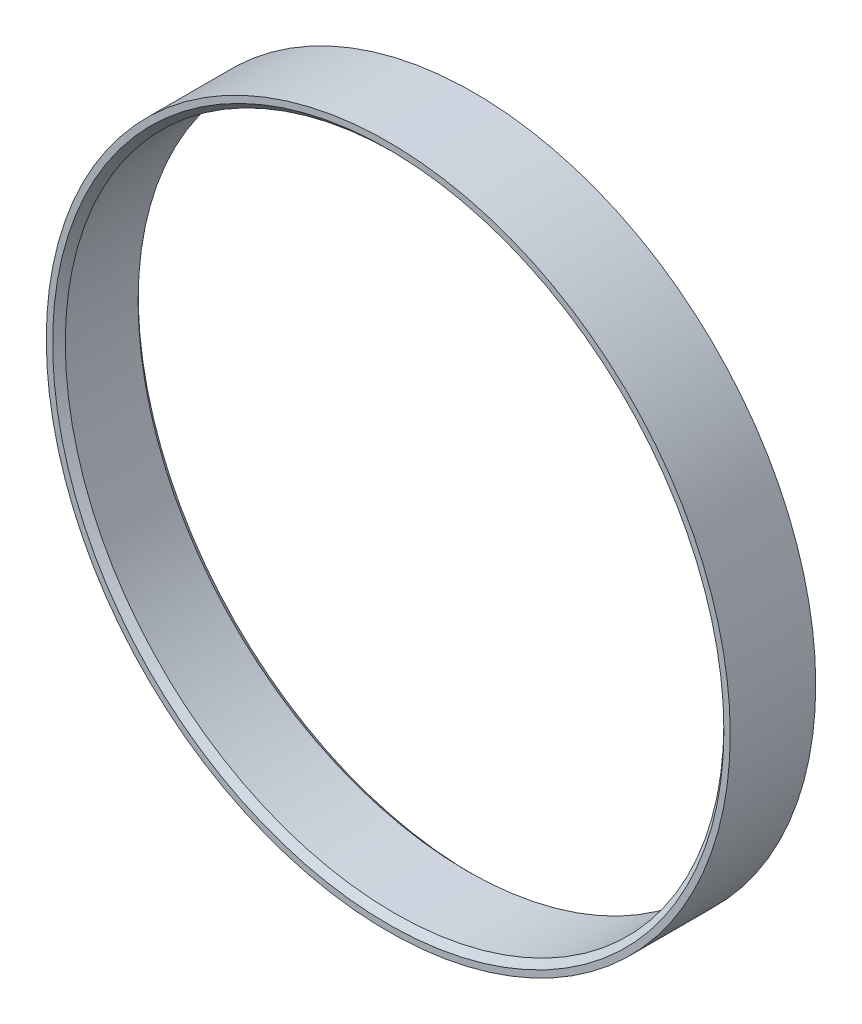
ISO-10303-21;
HEADER;
FILE_DESCRIPTION(('STEP AP214'),'2;1');
FILE_NAME('part.step','',(''),(''),'','','');
FILE_SCHEMA(('AUTOMOTIVE_DESIGN { 1 0 10303 214 1 1 1 1 }'));
ENDSEC;
DATA;
#1=APPLICATION_CONTEXT('core data for automotive mechanical design processes');
#2=APPLICATION_PROTOCOL_DEFINITION('international standard','automotive_design',2000,#1);
#3=PRODUCT_CONTEXT('',#1,'mechanical');
#4=PRODUCT('Part','Part','',(#3));
#5=PRODUCT_RELATED_PRODUCT_CATEGORY('part','',(#4));
#6=PRODUCT_DEFINITION_FORMATION('','',#4);
#7=PRODUCT_DEFINITION_CONTEXT('part definition',#1,'design');
#8=PRODUCT_DEFINITION('design','',#6,#7);
#9=PRODUCT_DEFINITION_SHAPE('','',#8);
#10=(LENGTH_UNIT() NAMED_UNIT(*) SI_UNIT(.MILLI.,.METRE.));
#11=(NAMED_UNIT(*) PLANE_ANGLE_UNIT() SI_UNIT($,.RADIAN.));
#12=(NAMED_UNIT(*) SI_UNIT($,.STERADIAN.) SOLID_ANGLE_UNIT());
#13=UNCERTAINTY_MEASURE_WITH_UNIT(LENGTH_MEASURE(1.E-05),#10,'distance_accuracy_value','');
#14=(GEOMETRIC_REPRESENTATION_CONTEXT(3) GLOBAL_UNCERTAINTY_ASSIGNED_CONTEXT((#13)) GLOBAL_UNIT_ASSIGNED_CONTEXT((#10,
#11,#12)) REPRESENTATION_CONTEXT('',''));
#15=CARTESIAN_POINT('',(0.,0.,0.));
#16=DIRECTION('',(0.,0.,1.));
#17=DIRECTION('',(1.,0.,0.));
#18=AXIS2_PLACEMENT_3D('',#15,#16,#17);
#19=CARTESIAN_POINT('',(0.,0.,13.5));
#20=DIRECTION('',(0.,0.,1.));
#21=DIRECTION('',(1.,0.,0.));
#22=AXIS2_PLACEMENT_3D('',#19,#20,#21);
#23=PLANE('',#22);
#24=CARTESIAN_POINT('',(0.,0.,13.5));
#25=DIRECTION('',(0.,0.,1.));
#26=DIRECTION('',(1.,0.,0.));
#27=AXIS2_PLACEMENT_3D('',#24,#25,#26);
#28=CIRCLE('',#27,53.);
#29=CARTESIAN_POINT('',(53.,0.,13.5));
#30=VERTEX_POINT('',#29);
#31=EDGE_CURVE('E10',#30,#30,#28,.F.);
#32=ORIENTED_EDGE('',*,*,#31,.T.);
#33=EDGE_LOOP('',(#32));
#34=FACE_BOUND('',#33,.T.);
#35=CARTESIAN_POINT('',(0.,0.,13.5));
#36=DIRECTION('',(0.,0.,1.));
#37=DIRECTION('',(1.,0.,0.));
#38=AXIS2_PLACEMENT_3D('',#35,#36,#37);
#39=CIRCLE('',#38,54.);
#40=CARTESIAN_POINT('',(54.,0.,13.5));
#41=VERTEX_POINT('',#40);
#42=EDGE_CURVE('E64',#41,#41,#39,.T.);
#43=ORIENTED_EDGE('',*,*,#42,.T.);
#44=EDGE_LOOP('',(#43));
#45=FACE_BOUND('',#44,.T.);
#46=ADVANCED_FACE('F39',(#34,#45),#23,.T.);
#47=CARTESIAN_POINT('',(0.,0.,0.));
#48=DIRECTION('',(0.,0.,1.));
#49=DIRECTION('',(1.,0.,0.));
#50=AXIS2_PLACEMENT_3D('',#47,#48,#49);
#51=PLANE('',#50);
#52=CARTESIAN_POINT('',(0.,0.,0.));
#53=DIRECTION('',(0.,0.,1.));
#54=DIRECTION('',(1.,0.,0.));
#55=AXIS2_PLACEMENT_3D('',#52,#53,#54);
#56=CIRCLE('',#55,53.);
#57=CARTESIAN_POINT('',(53.,0.,0.));
#58=VERTEX_POINT('',#57);
#59=EDGE_CURVE('E58',#58,#58,#56,.T.);
#60=ORIENTED_EDGE('',*,*,#59,.T.);
#61=EDGE_LOOP('',(#60));
#62=FACE_BOUND('',#61,.T.);
#63=CARTESIAN_POINT('',(0.,0.,0.));
#64=DIRECTION('',(0.,0.,1.));
#65=DIRECTION('',(1.,0.,0.));
#66=AXIS2_PLACEMENT_3D('',#63,#64,#65);
#67=CIRCLE('',#66,54.);
#68=CARTESIAN_POINT('',(54.,0.,0.));
#69=VERTEX_POINT('',#68);
#70=EDGE_CURVE('E65',#69,#69,#67,.T.);
#71=ORIENTED_EDGE('',*,*,#70,.F.);
#72=EDGE_LOOP('',(#71));
#73=FACE_BOUND('',#72,.T.);
#74=ADVANCED_FACE('F78',(#62,#73),#51,.F.);
#75=CARTESIAN_POINT('',(0.,0.,13.5));
#76=DIRECTION('',(0.,0.,-1.));
#77=DIRECTION('',(-1.,0.,0.));
#78=AXIS2_PLACEMENT_3D('',#75,#76,#77);
#79=CYLINDRICAL_SURFACE('',#78,54.);
#80=ORIENTED_EDGE('',*,*,#42,.F.);
#81=EDGE_LOOP('',(#80));
#82=FACE_BOUND('',#81,.T.);
#83=ORIENTED_EDGE('',*,*,#70,.T.);
#84=EDGE_LOOP('',(#83));
#85=FACE_BOUND('',#84,.T.);
#86=ADVANCED_FACE('F74',(#82,#85),#79,.T.);
#87=CARTESIAN_POINT('',(0.,0.,13.5));
#88=DIRECTION('',(0.,0.,-1.));
#89=DIRECTION('',(-1.,0.,0.));
#90=AXIS2_PLACEMENT_3D('',#87,#88,#89);
#91=CYLINDRICAL_SURFACE('',#90,52.);
#92=CARTESIAN_POINT('',(0.,0.,1.00000000000001));
#93=DIRECTION('',(0.,0.,1.));
#94=DIRECTION('',(1.,0.,0.));
#95=AXIS2_PLACEMENT_3D('',#92,#93,#94);
#96=CIRCLE('',#95,52.);
#97=CARTESIAN_POINT('',(52.,0.,1.00000000000001));
#98=VERTEX_POINT('',#97);
#99=EDGE_CURVE('E48',#98,#98,#96,.F.);
#100=ORIENTED_EDGE('',*,*,#99,.T.);
#101=EDGE_LOOP('',(#100));
#102=FACE_BOUND('',#101,.T.);
#103=CARTESIAN_POINT('',(0.,0.,12.5));
#104=DIRECTION('',(0.,0.,1.));
#105=DIRECTION('',(1.,0.,0.));
#106=AXIS2_PLACEMENT_3D('',#103,#104,#105);
#107=CIRCLE('',#106,52.);
#108=CARTESIAN_POINT('',(52.,0.,12.5));
#109=VERTEX_POINT('',#108);
#110=EDGE_CURVE('E53',#109,#109,#107,.T.);
#111=ORIENTED_EDGE('',*,*,#110,.T.);
#112=EDGE_LOOP('',(#111));
#113=FACE_BOUND('',#112,.T.);
#114=ADVANCED_FACE('F77',(#102,#113),#91,.F.);
#115=CARTESIAN_POINT('',(0.,0.,0.));
#116=DIRECTION('',(0.,0.,-1.));
#117=DIRECTION('',(-1.,0.,0.));
#118=AXIS2_PLACEMENT_3D('',#115,#116,#117);
#119=CONICAL_SURFACE('',#118,53.,0.785398163397448);
#120=ORIENTED_EDGE('',*,*,#99,.F.);
#121=EDGE_LOOP('',(#120));
#122=FACE_BOUND('',#121,.T.);
#123=ORIENTED_EDGE('',*,*,#59,.F.);
#124=EDGE_LOOP('',(#123));
#125=FACE_BOUND('',#124,.T.);
#126=ADVANCED_FACE('F91',(#122,#125),#119,.F.);
#127=CARTESIAN_POINT('',(0.,0.,12.5));
#128=DIRECTION('',(0.,0.,1.));
#129=DIRECTION('',(1.,0.,0.));
#130=AXIS2_PLACEMENT_3D('',#127,#128,#129);
#131=CONICAL_SURFACE('',#130,52.,0.785398163397445);
#132=ORIENTED_EDGE('',*,*,#31,.F.);
#133=EDGE_LOOP('',(#132));
#134=FACE_BOUND('',#133,.T.);
#135=ORIENTED_EDGE('',*,*,#110,.F.);
#136=EDGE_LOOP('',(#135));
#137=FACE_BOUND('',#136,.T.);
#138=ADVANCED_FACE('F42',(#134,#137),#131,.F.);
#139=CLOSED_SHELL('',(#46,#74,#86,#114,#126,#138));
#140=MANIFOLD_SOLID_BREP('B2',#139);
#141=ADVANCED_BREP_SHAPE_REPRESENTATION('',(#18,#140),#14);
#142=SHAPE_DEFINITION_REPRESENTATION(#9,#141);
ENDSEC;
END-ISO-10303-21;
